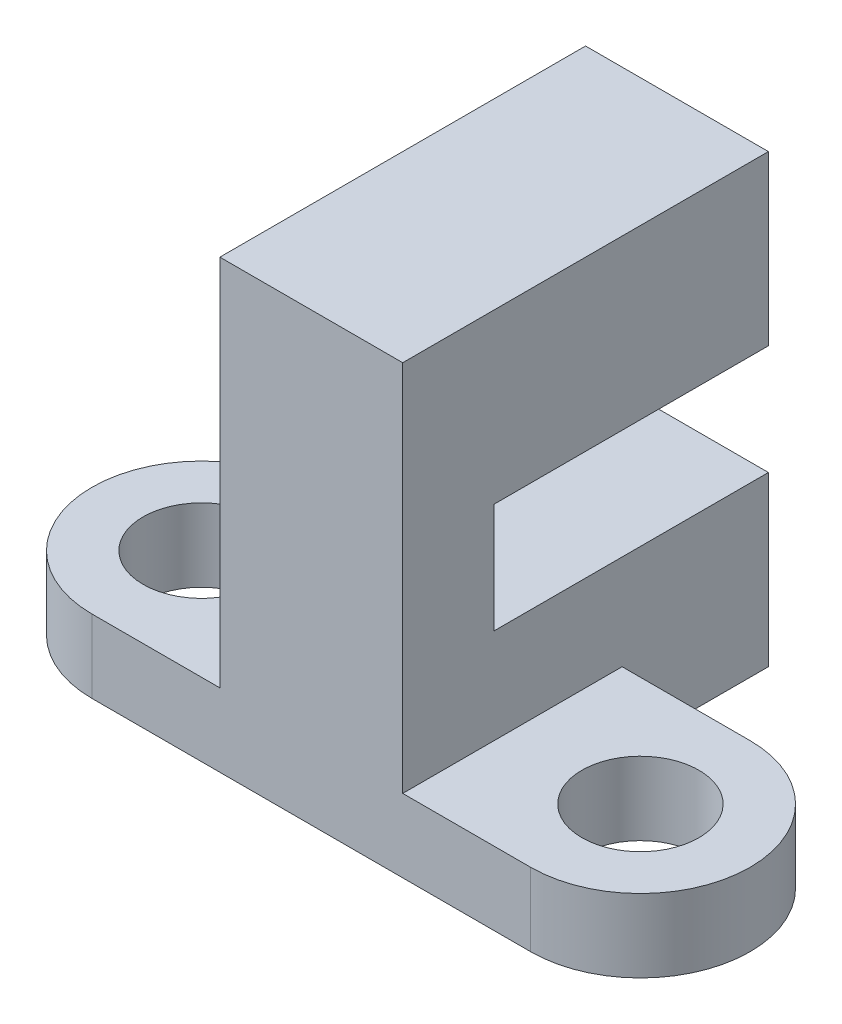
ISO-10303-21;
HEADER;
FILE_DESCRIPTION(('STEP AP214'),'2;1');
FILE_NAME('part.step','',(''),(''),'','','');
FILE_SCHEMA(('AUTOMOTIVE_DESIGN { 1 0 10303 214 1 1 1 1 }'));
ENDSEC;
DATA;
#1=APPLICATION_CONTEXT('core data for automotive mechanical design processes');
#2=APPLICATION_PROTOCOL_DEFINITION('international standard','automotive_design',2000,#1);
#3=PRODUCT_CONTEXT('',#1,'mechanical');
#4=PRODUCT('Part','Part','',(#3));
#5=PRODUCT_RELATED_PRODUCT_CATEGORY('part','',(#4));
#6=PRODUCT_DEFINITION_FORMATION('','',#4);
#7=PRODUCT_DEFINITION_CONTEXT('part definition',#1,'design');
#8=PRODUCT_DEFINITION('design','',#6,#7);
#9=PRODUCT_DEFINITION_SHAPE('','',#8);
#10=(LENGTH_UNIT() NAMED_UNIT(*) SI_UNIT(.MILLI.,.METRE.));
#11=(NAMED_UNIT(*) PLANE_ANGLE_UNIT() SI_UNIT($,.RADIAN.));
#12=(NAMED_UNIT(*) SI_UNIT($,.STERADIAN.) SOLID_ANGLE_UNIT());
#13=UNCERTAINTY_MEASURE_WITH_UNIT(LENGTH_MEASURE(1.E-05),#10,'distance_accuracy_value','');
#14=(GEOMETRIC_REPRESENTATION_CONTEXT(3) GLOBAL_UNCERTAINTY_ASSIGNED_CONTEXT((#13)) GLOBAL_UNIT_ASSIGNED_CONTEXT((#10,
#11,#12)) REPRESENTATION_CONTEXT('',''));
#15=CARTESIAN_POINT('',(0.,0.,0.));
#16=DIRECTION('',(0.,0.,1.));
#17=DIRECTION('',(1.,0.,0.));
#18=AXIS2_PLACEMENT_3D('',#15,#16,#17);
#19=CARTESIAN_POINT('',(-2.5,12.2,-7.));
#20=DIRECTION('',(0.,0.,-1.));
#21=DIRECTION('',(-1.,0.,0.));
#22=AXIS2_PLACEMENT_3D('',#19,#20,#21);
#23=PLANE('',#22);
#24=DIRECTION('',(1.,0.,0.));
#25=VECTOR('',#24,1.);
#26=CARTESIAN_POINT('',(2.5,7.6,-7.));
#27=LINE('',#26,#25);
#28=CARTESIAN_POINT('',(-2.5,7.6,-7.));
#29=VERTEX_POINT('',#28);
#30=CARTESIAN_POINT('',(2.5,7.6,-7.));
#31=VERTEX_POINT('',#30);
#32=EDGE_CURVE('E151',#29,#31,#27,.T.);
#33=ORIENTED_EDGE('',*,*,#32,.F.);
#34=DIRECTION('',(0.,-1.,0.));
#35=VECTOR('',#34,1.);
#36=CARTESIAN_POINT('',(-2.5,12.2,-7.));
#37=LINE('',#36,#35);
#38=CARTESIAN_POINT('',(-2.5,12.2,-7.));
#39=VERTEX_POINT('',#38);
#40=EDGE_CURVE('E195',#39,#29,#37,.T.);
#41=ORIENTED_EDGE('',*,*,#40,.F.);
#42=DIRECTION('',(1.,0.,0.));
#43=VECTOR('',#42,1.);
#44=CARTESIAN_POINT('',(-2.5,12.2,-7.));
#45=LINE('',#44,#43);
#46=CARTESIAN_POINT('',(2.5,12.2,-7.));
#47=VERTEX_POINT('',#46);
#48=EDGE_CURVE('E166',#39,#47,#45,.T.);
#49=ORIENTED_EDGE('',*,*,#48,.T.);
#50=DIRECTION('',(0.,-1.,0.));
#51=VECTOR('',#50,1.);
#52=CARTESIAN_POINT('',(2.5,12.2,-7.));
#53=LINE('',#52,#51);
#54=EDGE_CURVE('E192',#47,#31,#53,.T.);
#55=ORIENTED_EDGE('',*,*,#54,.T.);
#56=EDGE_LOOP('',(#33,#41,#49,#55));
#57=FACE_BOUND('',#56,.T.);
#58=ADVANCED_FACE('F34',(#57),#23,.T.);
#59=CARTESIAN_POINT('',(-6.,2.,0.));
#60=DIRECTION('',(0.,-1.,0.));
#61=DIRECTION('',(0.,0.,-1.));
#62=AXIS2_PLACEMENT_3D('',#59,#60,#61);
#63=PLANE('',#62);
#64=CARTESIAN_POINT('',(-6.,2.,0.));
#65=DIRECTION('',(0.,1.,0.));
#66=DIRECTION('',(0.,0.,1.));
#67=AXIS2_PLACEMENT_3D('',#64,#65,#66);
#68=CIRCLE('',#67,1.6);
#69=CARTESIAN_POINT('',(-6.,2.,1.6));
#70=VERTEX_POINT('',#69);
#71=EDGE_CURVE('E208',#70,#70,#68,.T.);
#72=ORIENTED_EDGE('',*,*,#71,.F.);
#73=EDGE_LOOP('',(#72));
#74=FACE_BOUND('',#73,.T.);
#75=DIRECTION('',(1.,0.,0.));
#76=VECTOR('',#75,1.);
#77=CARTESIAN_POINT('',(-6.,2.,3.));
#78=LINE('',#77,#76);
#79=CARTESIAN_POINT('',(-6.,2.,3.));
#80=VERTEX_POINT('',#79);
#81=CARTESIAN_POINT('',(-2.5,2.,3.));
#82=VERTEX_POINT('',#81);
#83=EDGE_CURVE('E219',#80,#82,#78,.T.);
#84=ORIENTED_EDGE('',*,*,#83,.T.);
#85=DIRECTION('',(0.,0.,-1.));
#86=VECTOR('',#85,1.);
#87=CARTESIAN_POINT('',(-2.5,2.,0.));
#88=LINE('',#87,#86);
#89=CARTESIAN_POINT('',(-2.5,2.,-3.));
#90=VERTEX_POINT('',#89);
#91=EDGE_CURVE('E199',#82,#90,#88,.T.);
#92=ORIENTED_EDGE('',*,*,#91,.T.);
#93=DIRECTION('',(-1.,0.,0.));
#94=VECTOR('',#93,1.);
#95=CARTESIAN_POINT('',(-6.,2.,-3.));
#96=LINE('',#95,#94);
#97=CARTESIAN_POINT('',(-6.,2.,-3.));
#98=VERTEX_POINT('',#97);
#99=EDGE_CURVE('E223',#90,#98,#96,.T.);
#100=ORIENTED_EDGE('',*,*,#99,.T.);
#101=CARTESIAN_POINT('',(-6.,2.,0.));
#102=DIRECTION('',(0.,1.,0.));
#103=DIRECTION('',(0.,0.,-1.));
#104=AXIS2_PLACEMENT_3D('',#101,#102,#103);
#105=CIRCLE('',#104,3.);
#106=EDGE_CURVE('E214',#98,#80,#105,.T.);
#107=ORIENTED_EDGE('',*,*,#106,.T.);
#108=EDGE_LOOP('',(#84,#92,#100,#107));
#109=FACE_BOUND('',#108,.T.);
#110=ADVANCED_FACE('F298',(#74,#109),#63,.F.);
#111=CARTESIAN_POINT('',(-6.,2.,-3.));
#112=DIRECTION('',(0.,0.,1.));
#113=DIRECTION('',(1.,0.,0.));
#114=AXIS2_PLACEMENT_3D('',#111,#112,#113);
#115=PLANE('',#114);
#116=ORIENTED_EDGE('',*,*,#99,.F.);
#117=DIRECTION('',(0.,-1.,0.));
#118=VECTOR('',#117,1.);
#119=CARTESIAN_POINT('',(-2.5,2.,-3.));
#120=LINE('',#119,#118);
#121=CARTESIAN_POINT('',(-2.5,0.,-3.));
#122=VERTEX_POINT('',#121);
#123=EDGE_CURVE('E11',#90,#122,#120,.T.);
#124=ORIENTED_EDGE('',*,*,#123,.T.);
#125=DIRECTION('',(-1.,0.,0.));
#126=VECTOR('',#125,1.);
#127=CARTESIAN_POINT('',(-6.,0.,-3.));
#128=LINE('',#127,#126);
#129=CARTESIAN_POINT('',(-6.,0.,-3.));
#130=VERTEX_POINT('',#129);
#131=EDGE_CURVE('E233',#122,#130,#128,.T.);
#132=ORIENTED_EDGE('',*,*,#131,.T.);
#133=DIRECTION('',(0.,-1.,0.));
#134=VECTOR('',#133,1.);
#135=CARTESIAN_POINT('',(-6.,2.,-3.));
#136=LINE('',#135,#134);
#137=EDGE_CURVE('E226',#98,#130,#136,.T.);
#138=ORIENTED_EDGE('',*,*,#137,.F.);
#139=EDGE_LOOP('',(#116,#124,#132,#138));
#140=FACE_BOUND('',#139,.T.);
#141=ADVANCED_FACE('F302',(#140),#115,.F.);
#142=CARTESIAN_POINT('',(6.,2.,-3.));
#143=VERTEX_POINT('',#142);
#144=CARTESIAN_POINT('',(2.5,2.,-3.));
#145=VERTEX_POINT('',#144);
#146=EDGE_CURVE('E224',#143,#145,#96,.T.);
#147=ORIENTED_EDGE('',*,*,#146,.T.);
#148=DIRECTION('',(0.,0.,1.));
#149=VECTOR('',#148,1.);
#150=CARTESIAN_POINT('',(2.5,2.,0.));
#151=LINE('',#150,#149);
#152=CARTESIAN_POINT('',(2.5,2.,3.));
#153=VERTEX_POINT('',#152);
#154=EDGE_CURVE('E57',#145,#153,#151,.T.);
#155=ORIENTED_EDGE('',*,*,#154,.T.);
#156=CARTESIAN_POINT('',(6.,2.,3.));
#157=VERTEX_POINT('',#156);
#158=EDGE_CURVE('E217',#153,#157,#78,.T.);
#159=ORIENTED_EDGE('',*,*,#158,.T.);
#160=CARTESIAN_POINT('',(6.,2.,0.));
#161=DIRECTION('',(0.,1.,0.));
#162=DIRECTION('',(0.,0.,-1.));
#163=AXIS2_PLACEMENT_3D('',#160,#161,#162);
#164=CIRCLE('',#163,3.);
#165=EDGE_CURVE('E221',#157,#143,#164,.T.);
#166=ORIENTED_EDGE('',*,*,#165,.T.);
#167=EDGE_LOOP('',(#147,#155,#159,#166));
#168=FACE_BOUND('',#167,.T.);
#169=CARTESIAN_POINT('',(6.,2.,0.));
#170=DIRECTION('',(0.,1.,0.));
#171=DIRECTION('',(0.,0.,1.));
#172=AXIS2_PLACEMENT_3D('',#169,#170,#171);
#173=CIRCLE('',#172,1.6);
#174=CARTESIAN_POINT('',(6.,2.,1.6));
#175=VERTEX_POINT('',#174);
#176=EDGE_CURVE('E202',#175,#175,#173,.T.);
#177=ORIENTED_EDGE('',*,*,#176,.F.);
#178=EDGE_LOOP('',(#177));
#179=FACE_BOUND('',#178,.T.);
#180=ADVANCED_FACE('F250',(#168,#179),#63,.F.);
#181=CARTESIAN_POINT('',(-6.,0.,0.));
#182=DIRECTION('',(0.,-1.,0.));
#183=DIRECTION('',(0.,0.,-1.));
#184=AXIS2_PLACEMENT_3D('',#181,#182,#183);
#185=PLANE('',#184);
#186=CARTESIAN_POINT('',(6.,0.,0.));
#187=DIRECTION('',(0.,1.,0.));
#188=DIRECTION('',(0.,0.,-1.));
#189=AXIS2_PLACEMENT_3D('',#186,#187,#188);
#190=CIRCLE('',#189,3.);
#191=CARTESIAN_POINT('',(6.,0.,3.));
#192=VERTEX_POINT('',#191);
#193=CARTESIAN_POINT('',(6.,0.,-3.));
#194=VERTEX_POINT('',#193);
#195=EDGE_CURVE('E231',#192,#194,#190,.T.);
#196=ORIENTED_EDGE('',*,*,#195,.F.);
#197=DIRECTION('',(1.,0.,0.));
#198=VECTOR('',#197,1.);
#199=CARTESIAN_POINT('',(-6.,0.,3.));
#200=LINE('',#199,#198);
#201=CARTESIAN_POINT('',(-6.,0.,3.));
#202=VERTEX_POINT('',#201);
#203=EDGE_CURVE('E229',#202,#192,#200,.T.);
#204=ORIENTED_EDGE('',*,*,#203,.F.);
#205=CARTESIAN_POINT('',(-6.,0.,0.));
#206=DIRECTION('',(0.,1.,0.));
#207=DIRECTION('',(0.,0.,-1.));
#208=AXIS2_PLACEMENT_3D('',#205,#206,#207);
#209=CIRCLE('',#208,3.);
#210=EDGE_CURVE('E211',#130,#202,#209,.T.);
#211=ORIENTED_EDGE('',*,*,#210,.F.);
#212=ORIENTED_EDGE('',*,*,#131,.F.);
#213=DIRECTION('',(0.,0.,-1.));
#214=VECTOR('',#213,1.);
#215=CARTESIAN_POINT('',(-2.5,0.,3.));
#216=LINE('',#215,#214);
#217=CARTESIAN_POINT('',(-2.5,0.,-7.));
#218=VERTEX_POINT('',#217);
#219=EDGE_CURVE('E177',#122,#218,#216,.T.);
#220=ORIENTED_EDGE('',*,*,#219,.T.);
#221=DIRECTION('',(1.,0.,0.));
#222=VECTOR('',#221,1.);
#223=CARTESIAN_POINT('',(-2.5,0.,-7.));
#224=LINE('',#223,#222);
#225=CARTESIAN_POINT('',(2.5,0.,-7.));
#226=VERTEX_POINT('',#225);
#227=EDGE_CURVE('E180',#218,#226,#224,.T.);
#228=ORIENTED_EDGE('',*,*,#227,.T.);
#229=DIRECTION('',(0.,0.,1.));
#230=VECTOR('',#229,1.);
#231=CARTESIAN_POINT('',(2.5,0.,3.));
#232=LINE('',#231,#230);
#233=CARTESIAN_POINT('',(2.5,0.,-3.));
#234=VERTEX_POINT('',#233);
#235=EDGE_CURVE('E167',#226,#234,#232,.T.);
#236=ORIENTED_EDGE('',*,*,#235,.T.);
#237=EDGE_CURVE('E218',#194,#234,#128,.T.);
#238=ORIENTED_EDGE('',*,*,#237,.F.);
#239=EDGE_LOOP('',(#196,#204,#211,#212,#220,#228,#236,#238));
#240=FACE_BOUND('',#239,.T.);
#241=CARTESIAN_POINT('',(6.,0.,0.));
#242=DIRECTION('',(0.,1.,0.));
#243=DIRECTION('',(0.,0.,1.));
#244=AXIS2_PLACEMENT_3D('',#241,#242,#243);
#245=CIRCLE('',#244,1.6);
#246=CARTESIAN_POINT('',(6.,0.,1.6));
#247=VERTEX_POINT('',#246);
#248=EDGE_CURVE('E201',#247,#247,#245,.T.);
#249=ORIENTED_EDGE('',*,*,#248,.T.);
#250=EDGE_LOOP('',(#249));
#251=FACE_BOUND('',#250,.T.);
#252=CARTESIAN_POINT('',(-6.,0.,0.));
#253=DIRECTION('',(0.,1.,0.));
#254=DIRECTION('',(0.,0.,1.));
#255=AXIS2_PLACEMENT_3D('',#252,#253,#254);
#256=CIRCLE('',#255,1.6);
#257=CARTESIAN_POINT('',(-6.,0.,1.6));
#258=VERTEX_POINT('',#257);
#259=EDGE_CURVE('E205',#258,#258,#256,.T.);
#260=ORIENTED_EDGE('',*,*,#259,.T.);
#261=EDGE_LOOP('',(#260));
#262=FACE_BOUND('',#261,.T.);
#263=ADVANCED_FACE('F263',(#240,#251,#262),#185,.T.);
#264=CARTESIAN_POINT('',(-6.,2.,0.));
#265=DIRECTION('',(0.,-1.,0.));
#266=DIRECTION('',(0.,0.,-1.));
#267=AXIS2_PLACEMENT_3D('',#264,#265,#266);
#268=CYLINDRICAL_SURFACE('',#267,3.);
#269=ORIENTED_EDGE('',*,*,#210,.T.);
#270=DIRECTION('',(0.,-1.,0.));
#271=VECTOR('',#270,1.);
#272=CARTESIAN_POINT('',(-6.,2.,3.));
#273=LINE('',#272,#271);
#274=EDGE_CURVE('E243',#80,#202,#273,.T.);
#275=ORIENTED_EDGE('',*,*,#274,.F.);
#276=ORIENTED_EDGE('',*,*,#106,.F.);
#277=ORIENTED_EDGE('',*,*,#137,.T.);
#278=EDGE_LOOP('',(#269,#275,#276,#277));
#279=FACE_BOUND('',#278,.T.);
#280=ADVANCED_FACE('F36',(#279),#268,.T.);
#281=CARTESIAN_POINT('',(-6.,2.,3.));
#282=DIRECTION('',(0.,0.,-1.));
#283=DIRECTION('',(-1.,0.,0.));
#284=AXIS2_PLACEMENT_3D('',#281,#282,#283);
#285=PLANE('',#284);
#286=ORIENTED_EDGE('',*,*,#158,.F.);
#287=DIRECTION('',(0.,-1.,0.));
#288=VECTOR('',#287,1.);
#289=CARTESIAN_POINT('',(2.5,12.2,3.));
#290=LINE('',#289,#288);
#291=CARTESIAN_POINT('',(2.5,12.2,3.));
#292=VERTEX_POINT('',#291);
#293=EDGE_CURVE('E189',#292,#153,#290,.T.);
#294=ORIENTED_EDGE('',*,*,#293,.F.);
#295=DIRECTION('',(-1.,0.,0.));
#296=VECTOR('',#295,1.);
#297=CARTESIAN_POINT('',(-2.5,12.2,3.));
#298=LINE('',#297,#296);
#299=CARTESIAN_POINT('',(-2.5,12.2,3.));
#300=VERTEX_POINT('',#299);
#301=EDGE_CURVE('E173',#292,#300,#298,.T.);
#302=ORIENTED_EDGE('',*,*,#301,.T.);
#303=DIRECTION('',(0.,-1.,0.));
#304=VECTOR('',#303,1.);
#305=CARTESIAN_POINT('',(-2.5,12.2,3.));
#306=LINE('',#305,#304);
#307=EDGE_CURVE('E186',#300,#82,#306,.T.);
#308=ORIENTED_EDGE('',*,*,#307,.T.);
#309=ORIENTED_EDGE('',*,*,#83,.F.);
#310=ORIENTED_EDGE('',*,*,#274,.T.);
#311=ORIENTED_EDGE('',*,*,#203,.T.);
#312=DIRECTION('',(0.,-1.,0.));
#313=VECTOR('',#312,1.);
#314=CARTESIAN_POINT('',(6.,2.,3.));
#315=LINE('',#314,#313);
#316=EDGE_CURVE('E240',#157,#192,#315,.T.);
#317=ORIENTED_EDGE('',*,*,#316,.F.);
#318=EDGE_LOOP('',(#286,#294,#302,#308,#309,#310,#311,#317));
#319=FACE_BOUND('',#318,.T.);
#320=ADVANCED_FACE('F257',(#319),#285,.F.);
#321=CARTESIAN_POINT('',(6.,2.,0.));
#322=DIRECTION('',(0.,-1.,0.));
#323=DIRECTION('',(0.,0.,-1.));
#324=AXIS2_PLACEMENT_3D('',#321,#322,#323);
#325=CYLINDRICAL_SURFACE('',#324,3.);
#326=ORIENTED_EDGE('',*,*,#195,.T.);
#327=DIRECTION('',(0.,-1.,0.));
#328=VECTOR('',#327,1.);
#329=CARTESIAN_POINT('',(6.,2.,-3.));
#330=LINE('',#329,#328);
#331=EDGE_CURVE('E237',#143,#194,#330,.T.);
#332=ORIENTED_EDGE('',*,*,#331,.F.);
#333=ORIENTED_EDGE('',*,*,#165,.F.);
#334=ORIENTED_EDGE('',*,*,#316,.T.);
#335=EDGE_LOOP('',(#326,#332,#333,#334));
#336=FACE_BOUND('',#335,.T.);
#337=ADVANCED_FACE('F261',(#336),#325,.T.);
#338=ORIENTED_EDGE('',*,*,#237,.T.);
#339=DIRECTION('',(0.,1.,0.));
#340=VECTOR('',#339,1.);
#341=CARTESIAN_POINT('',(2.5,2.,-3.));
#342=LINE('',#341,#340);
#343=EDGE_CURVE('E42',#234,#145,#342,.T.);
#344=ORIENTED_EDGE('',*,*,#343,.T.);
#345=ORIENTED_EDGE('',*,*,#146,.F.);
#346=ORIENTED_EDGE('',*,*,#331,.T.);
#347=EDGE_LOOP('',(#338,#344,#345,#346));
#348=FACE_BOUND('',#347,.T.);
#349=ADVANCED_FACE('F248',(#348),#115,.F.);
#350=CARTESIAN_POINT('',(-6.,2.,0.));
#351=DIRECTION('',(0.,-1.,0.));
#352=DIRECTION('',(0.,0.,-1.));
#353=AXIS2_PLACEMENT_3D('',#350,#351,#352);
#354=CYLINDRICAL_SURFACE('',#353,1.6);
#355=ORIENTED_EDGE('',*,*,#71,.T.);
#356=EDGE_LOOP('',(#355));
#357=FACE_BOUND('',#356,.T.);
#358=ORIENTED_EDGE('',*,*,#259,.F.);
#359=EDGE_LOOP('',(#358));
#360=FACE_BOUND('',#359,.T.);
#361=ADVANCED_FACE('F311',(#357,#360),#354,.F.);
#362=CARTESIAN_POINT('',(6.,2.,0.));
#363=DIRECTION('',(0.,-1.,0.));
#364=DIRECTION('',(0.,0.,-1.));
#365=AXIS2_PLACEMENT_3D('',#362,#363,#364);
#366=CYLINDRICAL_SURFACE('',#365,1.6);
#367=ORIENTED_EDGE('',*,*,#176,.T.);
#368=EDGE_LOOP('',(#367));
#369=FACE_BOUND('',#368,.T.);
#370=ORIENTED_EDGE('',*,*,#248,.F.);
#371=EDGE_LOOP('',(#370));
#372=FACE_BOUND('',#371,.T.);
#373=ADVANCED_FACE('F308',(#369,#372),#366,.F.);
#374=CARTESIAN_POINT('',(-2.5,12.2,3.));
#375=DIRECTION('',(-1.,0.,0.));
#376=DIRECTION('',(0.,0.,1.));
#377=AXIS2_PLACEMENT_3D('',#374,#375,#376);
#378=PLANE('',#377);
#379=DIRECTION('',(0.,0.,-1.));
#380=VECTOR('',#379,1.);
#381=CARTESIAN_POINT('',(-2.5,7.6,0.5));
#382=LINE('',#381,#380);
#383=CARTESIAN_POINT('',(-2.5,7.6,0.5));
#384=VERTEX_POINT('',#383);
#385=EDGE_CURVE('E158',#384,#29,#382,.T.);
#386=ORIENTED_EDGE('',*,*,#385,.F.);
#387=DIRECTION('',(0.,1.,0.));
#388=VECTOR('',#387,1.);
#389=CARTESIAN_POINT('',(-2.5,7.6,0.5));
#390=LINE('',#389,#388);
#391=CARTESIAN_POINT('',(-2.5,4.6,0.5));
#392=VERTEX_POINT('',#391);
#393=EDGE_CURVE('E141',#392,#384,#390,.T.);
#394=ORIENTED_EDGE('',*,*,#393,.F.);
#395=DIRECTION('',(0.,0.,-1.));
#396=VECTOR('',#395,1.);
#397=CARTESIAN_POINT('',(-2.5,4.6,0.5));
#398=LINE('',#397,#396);
#399=CARTESIAN_POINT('',(-2.5,4.6,-7.));
#400=VERTEX_POINT('',#399);
#401=EDGE_CURVE('E138',#392,#400,#398,.T.);
#402=ORIENTED_EDGE('',*,*,#401,.T.);
#403=EDGE_CURVE('E176',#400,#218,#37,.T.);
#404=ORIENTED_EDGE('',*,*,#403,.T.);
#405=ORIENTED_EDGE('',*,*,#219,.F.);
#406=ORIENTED_EDGE('',*,*,#123,.F.);
#407=ORIENTED_EDGE('',*,*,#91,.F.);
#408=ORIENTED_EDGE('',*,*,#307,.F.);
#409=DIRECTION('',(0.,0.,-1.));
#410=VECTOR('',#409,1.);
#411=CARTESIAN_POINT('',(-2.5,12.2,3.));
#412=LINE('',#411,#410);
#413=EDGE_CURVE('E163',#300,#39,#412,.T.);
#414=ORIENTED_EDGE('',*,*,#413,.T.);
#415=ORIENTED_EDGE('',*,*,#40,.T.);
#416=EDGE_LOOP('',(#386,#394,#402,#404,#405,#406,#407,#408,#414,#415));
#417=FACE_BOUND('',#416,.T.);
#418=ADVANCED_FACE('F282',(#417),#378,.T.);
#419=CARTESIAN_POINT('',(2.5,12.2,3.));
#420=DIRECTION('',(1.,0.,0.));
#421=DIRECTION('',(0.,0.,-1.));
#422=AXIS2_PLACEMENT_3D('',#419,#420,#421);
#423=PLANE('',#422);
#424=DIRECTION('',(0.,0.,-1.));
#425=VECTOR('',#424,1.);
#426=CARTESIAN_POINT('',(2.5,7.6,0.5));
#427=LINE('',#426,#425);
#428=CARTESIAN_POINT('',(2.5,7.6,0.5));
#429=VERTEX_POINT('',#428);
#430=EDGE_CURVE('E181',#429,#31,#427,.T.);
#431=ORIENTED_EDGE('',*,*,#430,.T.);
#432=ORIENTED_EDGE('',*,*,#54,.F.);
#433=DIRECTION('',(0.,0.,1.));
#434=VECTOR('',#433,1.);
#435=CARTESIAN_POINT('',(2.5,12.2,3.));
#436=LINE('',#435,#434);
#437=EDGE_CURVE('E170',#47,#292,#436,.T.);
#438=ORIENTED_EDGE('',*,*,#437,.T.);
#439=ORIENTED_EDGE('',*,*,#293,.T.);
#440=ORIENTED_EDGE('',*,*,#154,.F.);
#441=ORIENTED_EDGE('',*,*,#343,.F.);
#442=ORIENTED_EDGE('',*,*,#235,.F.);
#443=CARTESIAN_POINT('',(2.5,4.6,-7.));
#444=VERTEX_POINT('',#443);
#445=EDGE_CURVE('E156',#444,#226,#53,.T.);
#446=ORIENTED_EDGE('',*,*,#445,.F.);
#447=DIRECTION('',(0.,0.,-1.));
#448=VECTOR('',#447,1.);
#449=CARTESIAN_POINT('',(2.5,4.6,0.5));
#450=LINE('',#449,#448);
#451=CARTESIAN_POINT('',(2.5,4.6,0.5));
#452=VERTEX_POINT('',#451);
#453=EDGE_CURVE('E49',#452,#444,#450,.T.);
#454=ORIENTED_EDGE('',*,*,#453,.F.);
#455=DIRECTION('',(0.,-1.,0.));
#456=VECTOR('',#455,1.);
#457=CARTESIAN_POINT('',(2.5,7.6,0.5));
#458=LINE('',#457,#456);
#459=EDGE_CURVE('E142',#429,#452,#458,.T.);
#460=ORIENTED_EDGE('',*,*,#459,.F.);
#461=EDGE_LOOP('',(#431,#432,#438,#439,#440,#441,#442,#446,#454,#460));
#462=FACE_BOUND('',#461,.T.);
#463=ADVANCED_FACE('F154',(#462),#423,.T.);
#464=DIRECTION('',(-1.,0.,0.));
#465=VECTOR('',#464,1.);
#466=CARTESIAN_POINT('',(2.5,4.6,-7.));
#467=LINE('',#466,#465);
#468=EDGE_CURVE('E270',#444,#400,#467,.T.);
#469=ORIENTED_EDGE('',*,*,#468,.F.);
#470=ORIENTED_EDGE('',*,*,#445,.T.);
#471=ORIENTED_EDGE('',*,*,#227,.F.);
#472=ORIENTED_EDGE('',*,*,#403,.F.);
#473=EDGE_LOOP('',(#469,#470,#471,#472));
#474=FACE_BOUND('',#473,.T.);
#475=ADVANCED_FACE('F269',(#474),#23,.T.);
#476=CARTESIAN_POINT('',(0.,12.2,0.));
#477=DIRECTION('',(0.,-1.,0.));
#478=DIRECTION('',(0.,0.,-1.));
#479=AXIS2_PLACEMENT_3D('',#476,#477,#478);
#480=PLANE('',#479);
#481=ORIENTED_EDGE('',*,*,#413,.F.);
#482=ORIENTED_EDGE('',*,*,#301,.F.);
#483=ORIENTED_EDGE('',*,*,#437,.F.);
#484=ORIENTED_EDGE('',*,*,#48,.F.);
#485=EDGE_LOOP('',(#481,#482,#483,#484));
#486=FACE_BOUND('',#485,.T.);
#487=ADVANCED_FACE('F286',(#486),#480,.F.);
#488=CARTESIAN_POINT('',(2.5,7.6,0.5));
#489=DIRECTION('',(0.,1.,0.));
#490=DIRECTION('',(0.,0.,1.));
#491=AXIS2_PLACEMENT_3D('',#488,#489,#490);
#492=PLANE('',#491);
#493=ORIENTED_EDGE('',*,*,#32,.T.);
#494=ORIENTED_EDGE('',*,*,#430,.F.);
#495=DIRECTION('',(1.,0.,0.));
#496=VECTOR('',#495,1.);
#497=CARTESIAN_POINT('',(2.5,7.6,0.5));
#498=LINE('',#497,#496);
#499=EDGE_CURVE('E148',#384,#429,#498,.T.);
#500=ORIENTED_EDGE('',*,*,#499,.F.);
#501=ORIENTED_EDGE('',*,*,#385,.T.);
#502=EDGE_LOOP('',(#493,#494,#500,#501));
#503=FACE_BOUND('',#502,.T.);
#504=ADVANCED_FACE('F278',(#503),#492,.F.);
#505=CARTESIAN_POINT('',(2.5,4.6,0.5));
#506=DIRECTION('',(0.,-1.,0.));
#507=DIRECTION('',(0.,0.,-1.));
#508=AXIS2_PLACEMENT_3D('',#505,#506,#507);
#509=PLANE('',#508);
#510=ORIENTED_EDGE('',*,*,#468,.T.);
#511=ORIENTED_EDGE('',*,*,#401,.F.);
#512=DIRECTION('',(-1.,0.,0.));
#513=VECTOR('',#512,1.);
#514=CARTESIAN_POINT('',(2.5,4.6,0.5));
#515=LINE('',#514,#513);
#516=EDGE_CURVE('E134',#452,#392,#515,.T.);
#517=ORIENTED_EDGE('',*,*,#516,.F.);
#518=ORIENTED_EDGE('',*,*,#453,.T.);
#519=EDGE_LOOP('',(#510,#511,#517,#518));
#520=FACE_BOUND('',#519,.T.);
#521=ADVANCED_FACE('F136',(#520),#509,.F.);
#522=CARTESIAN_POINT('',(0.,0.,0.5));
#523=DIRECTION('',(0.,0.,-1.));
#524=DIRECTION('',(-1.,0.,0.));
#525=AXIS2_PLACEMENT_3D('',#522,#523,#524);
#526=PLANE('',#525);
#527=ORIENTED_EDGE('',*,*,#459,.T.);
#528=ORIENTED_EDGE('',*,*,#516,.T.);
#529=ORIENTED_EDGE('',*,*,#393,.T.);
#530=ORIENTED_EDGE('',*,*,#499,.T.);
#531=EDGE_LOOP('',(#527,#528,#529,#530));
#532=FACE_BOUND('',#531,.T.);
#533=ADVANCED_FACE('F146',(#532),#526,.T.);
#534=CLOSED_SHELL('',(#58,#110,#141,#180,#263,#280,#320,#337,#349,#361,#373,#418,#463,#475,#487,
#504,#521,#533));
#535=MANIFOLD_SOLID_BREP('B2',#534);
#536=ADVANCED_BREP_SHAPE_REPRESENTATION('',(#18,#535),#14);
#537=SHAPE_DEFINITION_REPRESENTATION(#9,#536);
ENDSEC;
END-ISO-10303-21;
